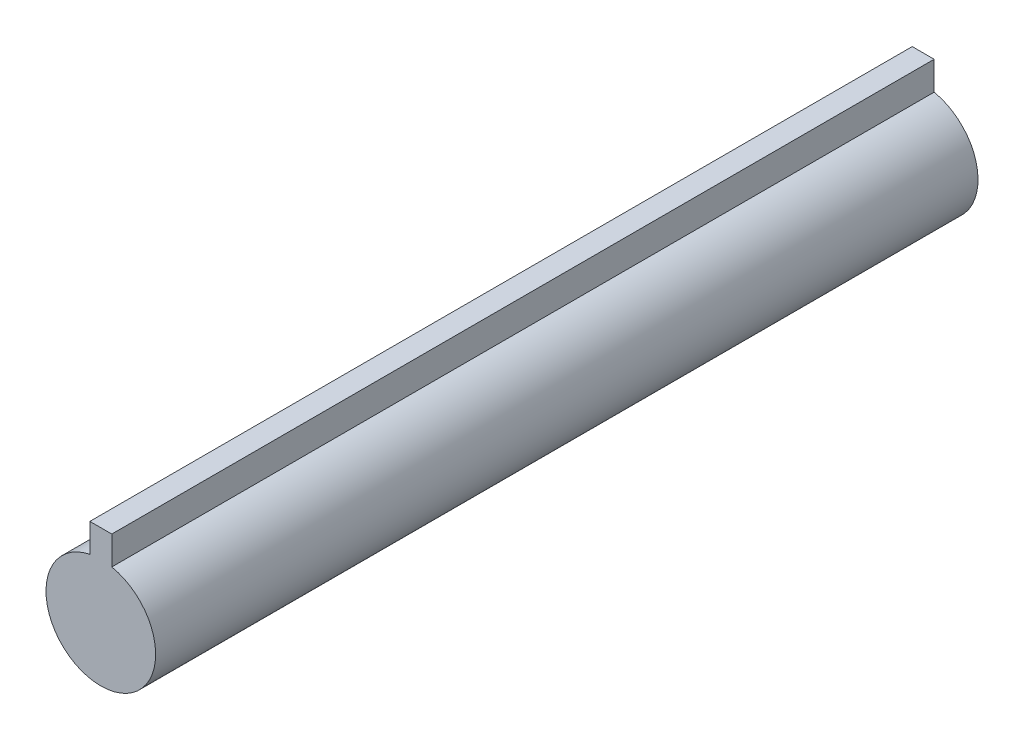
ISO-10303-21;
HEADER;
FILE_DESCRIPTION(('STEP AP214'),'2;1');
FILE_NAME('part.step','',(''),(''),'','','');
FILE_SCHEMA(('AUTOMOTIVE_DESIGN { 1 0 10303 214 1 1 1 1 }'));
ENDSEC;
DATA;
#1=APPLICATION_CONTEXT('core data for automotive mechanical design processes');
#2=APPLICATION_PROTOCOL_DEFINITION('international standard','automotive_design',2000,#1);
#3=PRODUCT_CONTEXT('',#1,'mechanical');
#4=PRODUCT('Part','Part','',(#3));
#5=PRODUCT_RELATED_PRODUCT_CATEGORY('part','',(#4));
#6=PRODUCT_DEFINITION_FORMATION('','',#4);
#7=PRODUCT_DEFINITION_CONTEXT('part definition',#1,'design');
#8=PRODUCT_DEFINITION('design','',#6,#7);
#9=PRODUCT_DEFINITION_SHAPE('','',#8);
#10=(LENGTH_UNIT() NAMED_UNIT(*) SI_UNIT(.MILLI.,.METRE.));
#11=(NAMED_UNIT(*) PLANE_ANGLE_UNIT() SI_UNIT($,.RADIAN.));
#12=(NAMED_UNIT(*) SI_UNIT($,.STERADIAN.) SOLID_ANGLE_UNIT());
#13=UNCERTAINTY_MEASURE_WITH_UNIT(LENGTH_MEASURE(1.E-05),#10,'distance_accuracy_value','');
#14=(GEOMETRIC_REPRESENTATION_CONTEXT(3) GLOBAL_UNCERTAINTY_ASSIGNED_CONTEXT((#13)) GLOBAL_UNIT_ASSIGNED_CONTEXT((#10,
#11,#12)) REPRESENTATION_CONTEXT('',''));
#15=CARTESIAN_POINT('',(0.,0.,0.));
#16=DIRECTION('',(0.,0.,1.));
#17=DIRECTION('',(1.,0.,0.));
#18=AXIS2_PLACEMENT_3D('',#15,#16,#17);
#19=CARTESIAN_POINT('',(-0.2,1.5,15.));
#20=DIRECTION('',(1.,0.,0.));
#21=DIRECTION('',(0.,1.,0.));
#22=AXIS2_PLACEMENT_3D('',#19,#20,#21);
#23=PLANE('',#22);
#24=DIRECTION('',(0.,-1.,0.));
#25=VECTOR('',#24,1.);
#26=CARTESIAN_POINT('',(-0.2,1.5,0.));
#27=LINE('',#26,#25);
#28=CARTESIAN_POINT('',(-0.2,1.5,0.));
#29=VERTEX_POINT('',#28);
#30=CARTESIAN_POINT('',(-0.2,0.979795897113271,0.));
#31=VERTEX_POINT('',#30);
#32=EDGE_CURVE('E94',#29,#31,#27,.T.);
#33=ORIENTED_EDGE('',*,*,#32,.T.);
#34=DIRECTION('',(0.,0.,-1.));
#35=VECTOR('',#34,1.);
#36=CARTESIAN_POINT('',(-0.2,0.979795897113271,15.));
#37=LINE('',#36,#35);
#38=CARTESIAN_POINT('',(-0.2,0.979795897113271,15.));
#39=VERTEX_POINT('',#38);
#40=EDGE_CURVE('E47',#39,#31,#37,.T.);
#41=ORIENTED_EDGE('',*,*,#40,.F.);
#42=DIRECTION('',(0.,-1.,0.));
#43=VECTOR('',#42,1.);
#44=CARTESIAN_POINT('',(-0.2,1.5,15.));
#45=LINE('',#44,#43);
#46=CARTESIAN_POINT('',(-0.2,1.5,15.));
#47=VERTEX_POINT('',#46);
#48=EDGE_CURVE('E86',#47,#39,#45,.T.);
#49=ORIENTED_EDGE('',*,*,#48,.F.);
#50=DIRECTION('',(0.,0.,-1.));
#51=VECTOR('',#50,1.);
#52=CARTESIAN_POINT('',(-0.2,1.5,15.));
#53=LINE('',#52,#51);
#54=EDGE_CURVE('E11',#47,#29,#53,.T.);
#55=ORIENTED_EDGE('',*,*,#54,.T.);
#56=EDGE_LOOP('',(#33,#41,#49,#55));
#57=FACE_BOUND('',#56,.T.);
#58=ADVANCED_FACE('F38',(#57),#23,.F.);
#59=CARTESIAN_POINT('',(0.,0.,15.));
#60=DIRECTION('',(0.,0.,-1.));
#61=DIRECTION('',(-1.,0.,0.));
#62=AXIS2_PLACEMENT_3D('',#59,#60,#61);
#63=CYLINDRICAL_SURFACE('',#62,0.999999999999999);
#64=CARTESIAN_POINT('',(0.,0.,0.));
#65=DIRECTION('',(0.,0.,1.));
#66=DIRECTION('',(1.,0.,0.));
#67=AXIS2_PLACEMENT_3D('',#64,#65,#66);
#68=CIRCLE('',#67,0.999999999999999);
#69=CARTESIAN_POINT('',(0.2,0.97979589711327,0.));
#70=VERTEX_POINT('',#69);
#71=EDGE_CURVE('E73',#31,#70,#68,.T.);
#72=ORIENTED_EDGE('',*,*,#71,.T.);
#73=DIRECTION('',(0.,0.,-1.));
#74=VECTOR('',#73,1.);
#75=CARTESIAN_POINT('',(0.2,0.97979589711327,15.));
#76=LINE('',#75,#74);
#77=CARTESIAN_POINT('',(0.2,0.97979589711327,15.));
#78=VERTEX_POINT('',#77);
#79=EDGE_CURVE('E96',#78,#70,#76,.T.);
#80=ORIENTED_EDGE('',*,*,#79,.F.);
#81=CARTESIAN_POINT('',(0.,0.,15.));
#82=DIRECTION('',(0.,0.,1.));
#83=DIRECTION('',(1.,0.,0.));
#84=AXIS2_PLACEMENT_3D('',#81,#82,#83);
#85=CIRCLE('',#84,0.999999999999999);
#86=EDGE_CURVE('E90',#39,#78,#85,.T.);
#87=ORIENTED_EDGE('',*,*,#86,.F.);
#88=ORIENTED_EDGE('',*,*,#40,.T.);
#89=EDGE_LOOP('',(#72,#80,#87,#88));
#90=FACE_BOUND('',#89,.T.);
#91=ADVANCED_FACE('F97',(#90),#63,.T.);
#92=CARTESIAN_POINT('',(0.2,1.5,15.));
#93=DIRECTION('',(-1.,0.,0.));
#94=DIRECTION('',(0.,-1.,0.));
#95=AXIS2_PLACEMENT_3D('',#92,#93,#94);
#96=PLANE('',#95);
#97=DIRECTION('',(0.,1.,0.));
#98=VECTOR('',#97,1.);
#99=CARTESIAN_POINT('',(0.2,1.5,0.));
#100=LINE('',#99,#98);
#101=CARTESIAN_POINT('',(0.2,1.5,0.));
#102=VERTEX_POINT('',#101);
#103=EDGE_CURVE('E80',#70,#102,#100,.T.);
#104=ORIENTED_EDGE('',*,*,#103,.T.);
#105=DIRECTION('',(0.,0.,-1.));
#106=VECTOR('',#105,1.);
#107=CARTESIAN_POINT('',(0.2,1.5,15.));
#108=LINE('',#107,#106);
#109=CARTESIAN_POINT('',(0.2,1.5,15.));
#110=VERTEX_POINT('',#109);
#111=EDGE_CURVE('E103',#110,#102,#108,.T.);
#112=ORIENTED_EDGE('',*,*,#111,.F.);
#113=DIRECTION('',(0.,1.,0.));
#114=VECTOR('',#113,1.);
#115=CARTESIAN_POINT('',(0.2,1.5,15.));
#116=LINE('',#115,#114);
#117=EDGE_CURVE('E100',#78,#110,#116,.T.);
#118=ORIENTED_EDGE('',*,*,#117,.F.);
#119=ORIENTED_EDGE('',*,*,#79,.T.);
#120=EDGE_LOOP('',(#104,#112,#118,#119));
#121=FACE_BOUND('',#120,.T.);
#122=ADVANCED_FACE('F119',(#121),#96,.F.);
#123=CARTESIAN_POINT('',(0.,1.5,15.));
#124=DIRECTION('',(0.,-1.,0.));
#125=DIRECTION('',(0.,0.,-1.));
#126=AXIS2_PLACEMENT_3D('',#123,#124,#125);
#127=PLANE('',#126);
#128=DIRECTION('',(-1.,0.,0.));
#129=VECTOR('',#128,1.);
#130=CARTESIAN_POINT('',(0.,1.5,0.));
#131=LINE('',#130,#129);
#132=EDGE_CURVE('E113',#102,#29,#131,.T.);
#133=ORIENTED_EDGE('',*,*,#132,.T.);
#134=ORIENTED_EDGE('',*,*,#54,.F.);
#135=DIRECTION('',(-1.,0.,0.));
#136=VECTOR('',#135,1.);
#137=CARTESIAN_POINT('',(0.,1.5,15.));
#138=LINE('',#137,#136);
#139=EDGE_CURVE('E55',#110,#47,#138,.T.);
#140=ORIENTED_EDGE('',*,*,#139,.F.);
#141=ORIENTED_EDGE('',*,*,#111,.T.);
#142=EDGE_LOOP('',(#133,#134,#140,#141));
#143=FACE_BOUND('',#142,.T.);
#144=ADVANCED_FACE('F123',(#143),#127,.F.);
#145=CARTESIAN_POINT('',(0.,0.,15.));
#146=DIRECTION('',(0.,0.,1.));
#147=DIRECTION('',(1.,0.,0.));
#148=AXIS2_PLACEMENT_3D('',#145,#146,#147);
#149=PLANE('',#148);
#150=ORIENTED_EDGE('',*,*,#139,.T.);
#151=ORIENTED_EDGE('',*,*,#48,.T.);
#152=ORIENTED_EDGE('',*,*,#86,.T.);
#153=ORIENTED_EDGE('',*,*,#117,.T.);
#154=EDGE_LOOP('',(#150,#151,#152,#153));
#155=FACE_BOUND('',#154,.T.);
#156=ADVANCED_FACE('F88',(#155),#149,.T.);
#157=CARTESIAN_POINT('',(0.,0.,0.));
#158=DIRECTION('',(0.,0.,1.));
#159=DIRECTION('',(1.,0.,0.));
#160=AXIS2_PLACEMENT_3D('',#157,#158,#159);
#161=PLANE('',#160);
#162=ORIENTED_EDGE('',*,*,#32,.F.);
#163=ORIENTED_EDGE('',*,*,#132,.F.);
#164=ORIENTED_EDGE('',*,*,#103,.F.);
#165=ORIENTED_EDGE('',*,*,#71,.F.);
#166=EDGE_LOOP('',(#162,#163,#164,#165));
#167=FACE_BOUND('',#166,.T.);
#168=ADVANCED_FACE('F122',(#167),#161,.F.);
#169=CLOSED_SHELL('',(#58,#91,#122,#144,#156,#168));
#170=MANIFOLD_SOLID_BREP('B2',#169);
#171=ADVANCED_BREP_SHAPE_REPRESENTATION('',(#18,#170),#14);
#172=SHAPE_DEFINITION_REPRESENTATION(#9,#171);
ENDSEC;
END-ISO-10303-21;
